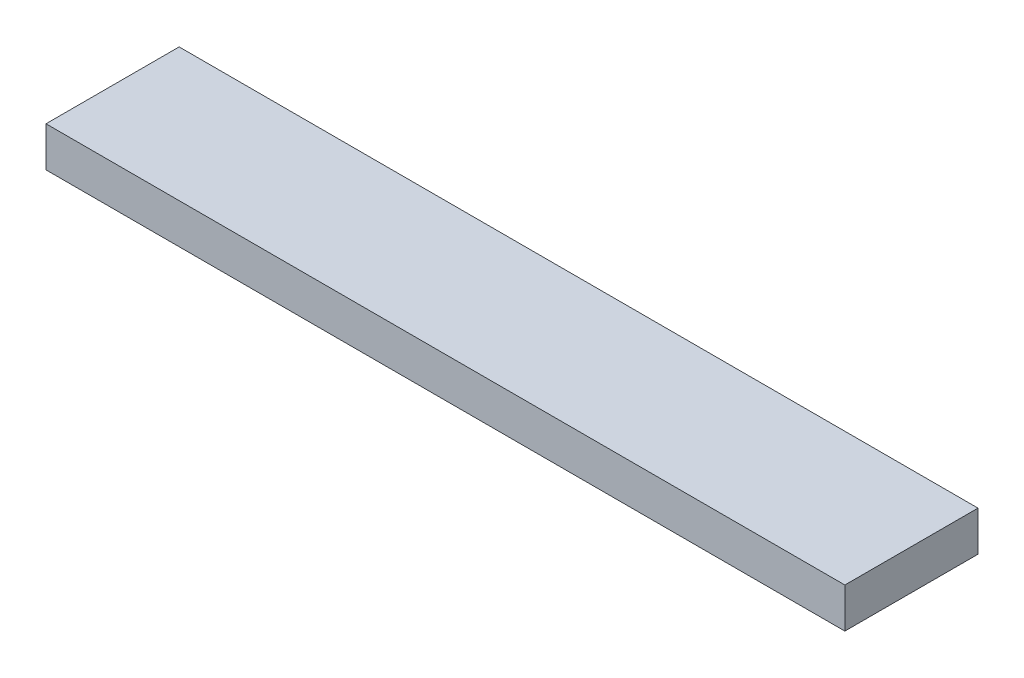
ISO-10303-21;
HEADER;
FILE_DESCRIPTION(('STEP AP214'),'2;1');
FILE_NAME('part.step','',(''),(''),'','','');
FILE_SCHEMA(('AUTOMOTIVE_DESIGN { 1 0 10303 214 1 1 1 1 }'));
ENDSEC;
DATA;
#1=APPLICATION_CONTEXT('core data for automotive mechanical design processes');
#2=APPLICATION_PROTOCOL_DEFINITION('international standard','automotive_design',2000,#1);
#3=PRODUCT_CONTEXT('',#1,'mechanical');
#4=PRODUCT('Part','Part','',(#3));
#5=PRODUCT_RELATED_PRODUCT_CATEGORY('part','',(#4));
#6=PRODUCT_DEFINITION_FORMATION('','',#4);
#7=PRODUCT_DEFINITION_CONTEXT('part definition',#1,'design');
#8=PRODUCT_DEFINITION('design','',#6,#7);
#9=PRODUCT_DEFINITION_SHAPE('','',#8);
#10=(LENGTH_UNIT() NAMED_UNIT(*) SI_UNIT(.MILLI.,.METRE.));
#11=(NAMED_UNIT(*) PLANE_ANGLE_UNIT() SI_UNIT($,.RADIAN.));
#12=(NAMED_UNIT(*) SI_UNIT($,.STERADIAN.) SOLID_ANGLE_UNIT());
#13=UNCERTAINTY_MEASURE_WITH_UNIT(LENGTH_MEASURE(1.E-05),#10,'distance_accuracy_value','');
#14=(GEOMETRIC_REPRESENTATION_CONTEXT(3) GLOBAL_UNCERTAINTY_ASSIGNED_CONTEXT((#13)) GLOBAL_UNIT_ASSIGNED_CONTEXT((#10,
#11,#12)) REPRESENTATION_CONTEXT('',''));
#15=CARTESIAN_POINT('',(0.,0.,0.));
#16=DIRECTION('',(0.,0.,1.));
#17=DIRECTION('',(1.,0.,0.));
#18=AXIS2_PLACEMENT_3D('',#15,#16,#17);
#19=CARTESIAN_POINT('',(0.,3.,0.));
#20=DIRECTION('',(-1.,0.,0.));
#21=DIRECTION('',(0.,0.,1.));
#22=AXIS2_PLACEMENT_3D('',#19,#20,#21);
#23=PLANE('',#22);
#24=DIRECTION('',(0.,0.,-1.));
#25=VECTOR('',#24,1.);
#26=CARTESIAN_POINT('',(0.,0.,0.));
#27=LINE('',#26,#25);
#28=CARTESIAN_POINT('',(0.,0.,0.));
#29=VERTEX_POINT('',#28);
#30=CARTESIAN_POINT('',(0.,0.,-10.));
#31=VERTEX_POINT('',#30);
#32=EDGE_CURVE('E99',#29,#31,#27,.T.);
#33=ORIENTED_EDGE('',*,*,#32,.T.);
#34=DIRECTION('',(0.,-1.,0.));
#35=VECTOR('',#34,1.);
#36=CARTESIAN_POINT('',(0.,3.,-10.));
#37=LINE('',#36,#35);
#38=CARTESIAN_POINT('',(0.,3.,-10.));
#39=VERTEX_POINT('',#38);
#40=EDGE_CURVE('E11',#39,#31,#37,.T.);
#41=ORIENTED_EDGE('',*,*,#40,.F.);
#42=DIRECTION('',(0.,0.,-1.));
#43=VECTOR('',#42,1.);
#44=CARTESIAN_POINT('',(0.,3.,0.));
#45=LINE('',#44,#43);
#46=CARTESIAN_POINT('',(0.,3.,0.));
#47=VERTEX_POINT('',#46);
#48=EDGE_CURVE('E87',#47,#39,#45,.T.);
#49=ORIENTED_EDGE('',*,*,#48,.F.);
#50=DIRECTION('',(0.,-1.,0.));
#51=VECTOR('',#50,1.);
#52=CARTESIAN_POINT('',(0.,3.,0.));
#53=LINE('',#52,#51);
#54=EDGE_CURVE('E95',#47,#29,#53,.T.);
#55=ORIENTED_EDGE('',*,*,#54,.T.);
#56=EDGE_LOOP('',(#33,#41,#49,#55));
#57=FACE_BOUND('',#56,.T.);
#58=ADVANCED_FACE('F36',(#57),#23,.F.);
#59=CARTESIAN_POINT('',(0.,3.,-10.));
#60=DIRECTION('',(0.,0.,1.));
#61=DIRECTION('',(1.,0.,0.));
#62=AXIS2_PLACEMENT_3D('',#59,#60,#61);
#63=PLANE('',#62);
#64=DIRECTION('',(-1.,0.,0.));
#65=VECTOR('',#64,1.);
#66=CARTESIAN_POINT('',(0.,0.,-10.));
#67=LINE('',#66,#65);
#68=CARTESIAN_POINT('',(-60.,0.,-9.99999999999999));
#69=VERTEX_POINT('',#68);
#70=EDGE_CURVE('E91',#31,#69,#67,.T.);
#71=ORIENTED_EDGE('',*,*,#70,.T.);
#72=DIRECTION('',(0.,-1.,0.));
#73=VECTOR('',#72,1.);
#74=CARTESIAN_POINT('',(-60.,3.,-9.99999999999999));
#75=LINE('',#74,#73);
#76=CARTESIAN_POINT('',(-60.,3.,-9.99999999999999));
#77=VERTEX_POINT('',#76);
#78=EDGE_CURVE('E44',#77,#69,#75,.T.);
#79=ORIENTED_EDGE('',*,*,#78,.F.);
#80=DIRECTION('',(-1.,0.,0.));
#81=VECTOR('',#80,1.);
#82=CARTESIAN_POINT('',(0.,3.,-10.));
#83=LINE('',#82,#81);
#84=EDGE_CURVE('E82',#39,#77,#83,.T.);
#85=ORIENTED_EDGE('',*,*,#84,.F.);
#86=ORIENTED_EDGE('',*,*,#40,.T.);
#87=EDGE_LOOP('',(#71,#79,#85,#86));
#88=FACE_BOUND('',#87,.T.);
#89=ADVANCED_FACE('F90',(#88),#63,.F.);
#90=CARTESIAN_POINT('',(-60.,3.,0.));
#91=DIRECTION('',(1.,0.,0.));
#92=DIRECTION('',(0.,0.,-1.));
#93=AXIS2_PLACEMENT_3D('',#90,#91,#92);
#94=PLANE('',#93);
#95=DIRECTION('',(0.,0.,1.));
#96=VECTOR('',#95,1.);
#97=CARTESIAN_POINT('',(-60.,0.,0.));
#98=LINE('',#97,#96);
#99=CARTESIAN_POINT('',(-60.,0.,0.));
#100=VERTEX_POINT('',#99);
#101=EDGE_CURVE('E69',#69,#100,#98,.T.);
#102=ORIENTED_EDGE('',*,*,#101,.T.);
#103=DIRECTION('',(0.,-1.,0.));
#104=VECTOR('',#103,1.);
#105=CARTESIAN_POINT('',(-60.,3.,0.));
#106=LINE('',#105,#104);
#107=CARTESIAN_POINT('',(-60.,3.,0.));
#108=VERTEX_POINT('',#107);
#109=EDGE_CURVE('E92',#108,#100,#106,.T.);
#110=ORIENTED_EDGE('',*,*,#109,.F.);
#111=DIRECTION('',(0.,0.,1.));
#112=VECTOR('',#111,1.);
#113=CARTESIAN_POINT('',(-60.,3.,0.));
#114=LINE('',#113,#112);
#115=EDGE_CURVE('E85',#77,#108,#114,.T.);
#116=ORIENTED_EDGE('',*,*,#115,.F.);
#117=ORIENTED_EDGE('',*,*,#78,.T.);
#118=EDGE_LOOP('',(#102,#110,#116,#117));
#119=FACE_BOUND('',#118,.T.);
#120=ADVANCED_FACE('F93',(#119),#94,.F.);
#121=CARTESIAN_POINT('',(0.,3.,0.));
#122=DIRECTION('',(0.,0.,-1.));
#123=DIRECTION('',(-1.,0.,0.));
#124=AXIS2_PLACEMENT_3D('',#121,#122,#123);
#125=PLANE('',#124);
#126=DIRECTION('',(1.,0.,0.));
#127=VECTOR('',#126,1.);
#128=CARTESIAN_POINT('',(0.,0.,0.));
#129=LINE('',#128,#127);
#130=EDGE_CURVE('E75',#100,#29,#129,.T.);
#131=ORIENTED_EDGE('',*,*,#130,.T.);
#132=ORIENTED_EDGE('',*,*,#54,.F.);
#133=DIRECTION('',(1.,0.,0.));
#134=VECTOR('',#133,1.);
#135=CARTESIAN_POINT('',(0.,3.,0.));
#136=LINE('',#135,#134);
#137=EDGE_CURVE('E52',#108,#47,#136,.T.);
#138=ORIENTED_EDGE('',*,*,#137,.F.);
#139=ORIENTED_EDGE('',*,*,#109,.T.);
#140=EDGE_LOOP('',(#131,#132,#138,#139));
#141=FACE_BOUND('',#140,.T.);
#142=ADVANCED_FACE('F106',(#141),#125,.F.);
#143=CARTESIAN_POINT('',(0.,3.,0.));
#144=DIRECTION('',(0.,1.,0.));
#145=DIRECTION('',(0.,0.,1.));
#146=AXIS2_PLACEMENT_3D('',#143,#144,#145);
#147=PLANE('',#146);
#148=ORIENTED_EDGE('',*,*,#48,.T.);
#149=ORIENTED_EDGE('',*,*,#84,.T.);
#150=ORIENTED_EDGE('',*,*,#115,.T.);
#151=ORIENTED_EDGE('',*,*,#137,.T.);
#152=EDGE_LOOP('',(#148,#149,#150,#151));
#153=FACE_BOUND('',#152,.T.);
#154=ADVANCED_FACE('F83',(#153),#147,.T.);
#155=CARTESIAN_POINT('',(0.,0.,0.));
#156=DIRECTION('',(0.,1.,0.));
#157=DIRECTION('',(0.,0.,1.));
#158=AXIS2_PLACEMENT_3D('',#155,#156,#157);
#159=PLANE('',#158);
#160=ORIENTED_EDGE('',*,*,#32,.F.);
#161=ORIENTED_EDGE('',*,*,#130,.F.);
#162=ORIENTED_EDGE('',*,*,#101,.F.);
#163=ORIENTED_EDGE('',*,*,#70,.F.);
#164=EDGE_LOOP('',(#160,#161,#162,#163));
#165=FACE_BOUND('',#164,.T.);
#166=ADVANCED_FACE('F109',(#165),#159,.F.);
#167=CLOSED_SHELL('',(#58,#89,#120,#142,#154,#166));
#168=MANIFOLD_SOLID_BREP('B2',#167);
#169=ADVANCED_BREP_SHAPE_REPRESENTATION('',(#18,#168),#14);
#170=SHAPE_DEFINITION_REPRESENTATION(#9,#169);
ENDSEC;
END-ISO-10303-21;
